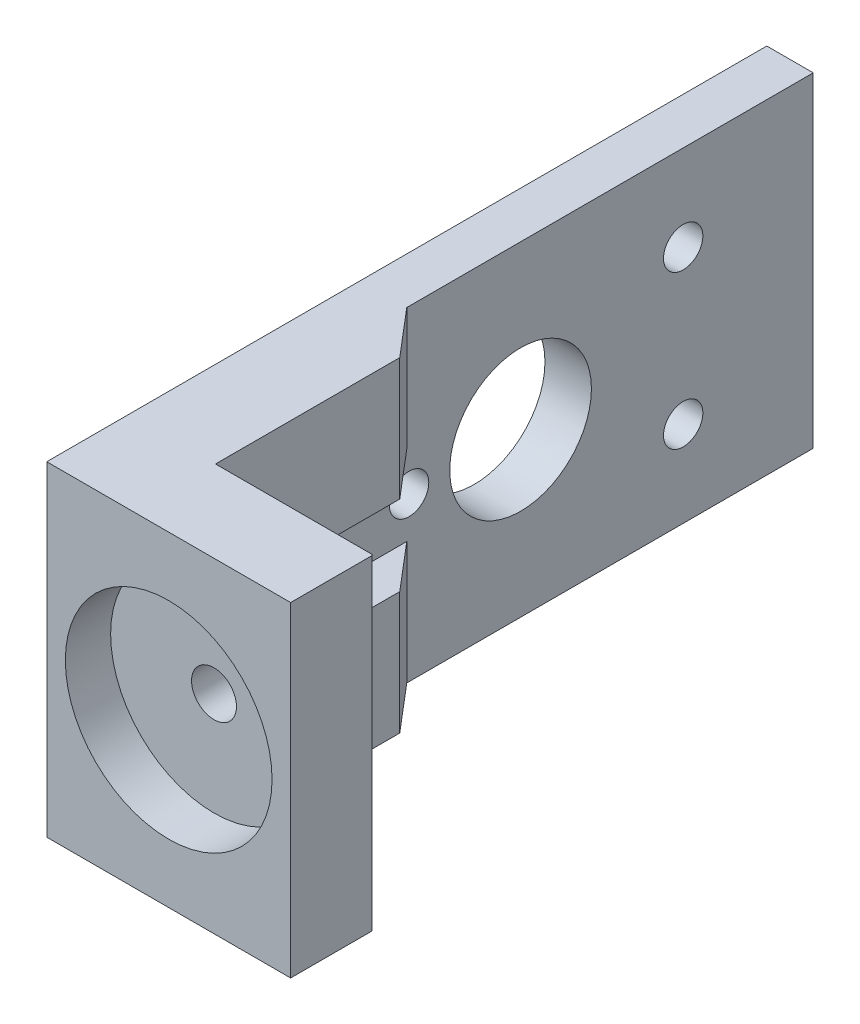
ISO-10303-21;
HEADER;
FILE_DESCRIPTION(('STEP AP214'),'2;1');
FILE_NAME('part.step','',(''),(''),'','','');
FILE_SCHEMA(('AUTOMOTIVE_DESIGN { 1 0 10303 214 1 1 1 1 }'));
ENDSEC;
DATA;
#1=APPLICATION_CONTEXT('core data for automotive mechanical design processes');
#2=APPLICATION_PROTOCOL_DEFINITION('international standard','automotive_design',2000,#1);
#3=PRODUCT_CONTEXT('',#1,'mechanical');
#4=PRODUCT('Part','Part','',(#3));
#5=PRODUCT_RELATED_PRODUCT_CATEGORY('part','',(#4));
#6=PRODUCT_DEFINITION_FORMATION('','',#4);
#7=PRODUCT_DEFINITION_CONTEXT('part definition',#1,'design');
#8=PRODUCT_DEFINITION('design','',#6,#7);
#9=PRODUCT_DEFINITION_SHAPE('','',#8);
#10=(LENGTH_UNIT() NAMED_UNIT(*) SI_UNIT(.MILLI.,.METRE.));
#11=(NAMED_UNIT(*) PLANE_ANGLE_UNIT() SI_UNIT($,.RADIAN.));
#12=(NAMED_UNIT(*) SI_UNIT($,.STERADIAN.) SOLID_ANGLE_UNIT());
#13=UNCERTAINTY_MEASURE_WITH_UNIT(LENGTH_MEASURE(1.E-05),#10,'distance_accuracy_value','');
#14=(GEOMETRIC_REPRESENTATION_CONTEXT(3) GLOBAL_UNCERTAINTY_ASSIGNED_CONTEXT((#13)) GLOBAL_UNIT_ASSIGNED_CONTEXT((#10,
#11,#12)) REPRESENTATION_CONTEXT('',''));
#15=CARTESIAN_POINT('',(0.,0.,0.));
#16=DIRECTION('',(0.,0.,1.));
#17=DIRECTION('',(1.,0.,0.));
#18=AXIS2_PLACEMENT_3D('',#15,#16,#17);
#19=CARTESIAN_POINT('',(5.08,22.1615,-34.29));
#20=DIRECTION('',(0.761939317759459,0.,-0.64764842009554));
#21=DIRECTION('',(-0.64764842009554,0.,-0.761939317759459));
#22=AXIS2_PLACEMENT_3D('',#19,#20,#21);
#23=PLANE('',#22);
#24=DIRECTION('',(0.,1.,0.));
#25=VECTOR('',#24,1.);
#26=CARTESIAN_POINT('',(9.44083677553739,22.1615,-29.1596037934854));
#27=LINE('',#26,#25);
#28=CARTESIAN_POINT('',(9.44083677553739,22.1615,-29.1596037934854));
#29=VERTEX_POINT('',#28);
#30=CARTESIAN_POINT('',(9.44083677553739,35.56,-29.1596037934854));
#31=VERTEX_POINT('',#30);
#32=EDGE_CURVE('E165',#29,#31,#27,.T.);
#33=ORIENTED_EDGE('',*,*,#32,.F.);
#34=DIRECTION('',(-0.64764842009554,0.,-0.76193931775946));
#35=VECTOR('',#34,1.);
#36=CARTESIAN_POINT('',(5.08,22.1615,-34.29));
#37=LINE('',#36,#35);
#38=CARTESIAN_POINT('',(5.08,22.1615,-34.29));
#39=VERTEX_POINT('',#38);
#40=EDGE_CURVE('E213',#29,#39,#37,.T.);
#41=ORIENTED_EDGE('',*,*,#40,.T.);
#42=DIRECTION('',(0.,1.,0.));
#43=VECTOR('',#42,1.);
#44=CARTESIAN_POINT('',(5.08,22.1615,-34.29));
#45=LINE('',#44,#43);
#46=CARTESIAN_POINT('',(5.08,35.56,-34.29));
#47=VERTEX_POINT('',#46);
#48=EDGE_CURVE('E219',#39,#47,#45,.T.);
#49=ORIENTED_EDGE('',*,*,#48,.T.);
#50=DIRECTION('',(-0.64764842009554,0.,-0.76193931775946));
#51=VECTOR('',#50,1.);
#52=CARTESIAN_POINT('',(5.08,35.56,-34.29));
#53=LINE('',#52,#51);
#54=EDGE_CURVE('E208',#31,#47,#53,.T.);
#55=ORIENTED_EDGE('',*,*,#54,.F.);
#56=EDGE_LOOP('',(#33,#41,#49,#55));
#57=FACE_BOUND('',#56,.T.);
#58=ADVANCED_FACE('F47',(#57),#23,.T.);
#59=CARTESIAN_POINT('',(5.08,13.3985,-34.29));
#60=DIRECTION('',(0.761939317759459,0.,-0.64764842009554));
#61=DIRECTION('',(-0.64764842009554,0.,-0.761939317759459));
#62=AXIS2_PLACEMENT_3D('',#59,#60,#61);
#63=PLANE('',#62);
#64=DIRECTION('',(0.,1.,0.));
#65=VECTOR('',#64,1.);
#66=CARTESIAN_POINT('',(9.44083677553739,13.3985,-29.1596037934854));
#67=LINE('',#66,#65);
#68=CARTESIAN_POINT('',(9.44083677553739,0.,-29.1596037934854));
#69=VERTEX_POINT('',#68);
#70=CARTESIAN_POINT('',(9.4408367755374,13.3985,-29.1596037934854));
#71=VERTEX_POINT('',#70);
#72=EDGE_CURVE('E182',#69,#71,#67,.T.);
#73=ORIENTED_EDGE('',*,*,#72,.F.);
#74=DIRECTION('',(0.64764842009554,0.,0.76193931775946));
#75=VECTOR('',#74,1.);
#76=CARTESIAN_POINT('',(5.08,0.,-34.29));
#77=LINE('',#76,#75);
#78=CARTESIAN_POINT('',(5.08,0.,-34.29));
#79=VERTEX_POINT('',#78);
#80=EDGE_CURVE('E202',#79,#69,#77,.T.);
#81=ORIENTED_EDGE('',*,*,#80,.F.);
#82=DIRECTION('',(0.,-1.,0.));
#83=VECTOR('',#82,1.);
#84=CARTESIAN_POINT('',(5.08,13.3985,-34.29));
#85=LINE('',#84,#83);
#86=CARTESIAN_POINT('',(5.08,13.3985,-34.29));
#87=VERTEX_POINT('',#86);
#88=EDGE_CURVE('E205',#87,#79,#85,.T.);
#89=ORIENTED_EDGE('',*,*,#88,.F.);
#90=DIRECTION('',(0.64764842009554,0.,0.76193931775946));
#91=VECTOR('',#90,1.);
#92=CARTESIAN_POINT('',(5.08,13.3985,-34.29));
#93=LINE('',#92,#91);
#94=EDGE_CURVE('E191',#87,#71,#93,.T.);
#95=ORIENTED_EDGE('',*,*,#94,.T.);
#96=EDGE_LOOP('',(#73,#81,#89,#95));
#97=FACE_BOUND('',#96,.T.);
#98=ADVANCED_FACE('F320',(#97),#63,.T.);
#99=CARTESIAN_POINT('',(0.,35.56,-8.89));
#100=DIRECTION('',(0.,0.,-1.));
#101=DIRECTION('',(-1.,0.,0.));
#102=AXIS2_PLACEMENT_3D('',#99,#100,#101);
#103=PLANE('',#102);
#104=CARTESIAN_POINT('',(13.335,17.78,-8.89));
#105=DIRECTION('',(0.,0.,-1.));
#106=DIRECTION('',(-1.,0.,0.));
#107=AXIS2_PLACEMENT_3D('',#104,#105,#106);
#108=CIRCLE('',#107,2.45745);
#109=CARTESIAN_POINT('',(10.87755,17.78,-8.89));
#110=VERTEX_POINT('',#109);
#111=EDGE_CURVE('E250',#110,#110,#108,.T.);
#112=ORIENTED_EDGE('',*,*,#111,.F.);
#113=EDGE_LOOP('',(#112));
#114=FACE_BOUND('',#113,.T.);
#115=DIRECTION('',(0.,-1.,0.));
#116=VECTOR('',#115,1.);
#117=CARTESIAN_POINT('',(26.67,35.56,-8.89));
#118=LINE('',#117,#116);
#119=CARTESIAN_POINT('',(26.67,22.1615,-8.89));
#120=VERTEX_POINT('',#119);
#121=CARTESIAN_POINT('',(26.67,13.3985,-8.89));
#122=VERTEX_POINT('',#121);
#123=EDGE_CURVE('E287',#120,#122,#118,.T.);
#124=ORIENTED_EDGE('',*,*,#123,.T.);
#125=DIRECTION('',(-1.,0.,0.));
#126=VECTOR('',#125,1.);
#127=CARTESIAN_POINT('',(26.67,13.3985,-8.89));
#128=LINE('',#127,#126);
#129=CARTESIAN_POINT('',(5.08,13.3985,-8.89));
#130=VERTEX_POINT('',#129);
#131=EDGE_CURVE('E194',#122,#130,#128,.T.);
#132=ORIENTED_EDGE('',*,*,#131,.T.);
#133=DIRECTION('',(0.,-1.,0.));
#134=VECTOR('',#133,1.);
#135=CARTESIAN_POINT('',(5.08,35.56,-8.89));
#136=LINE('',#135,#134);
#137=CARTESIAN_POINT('',(5.08,22.1615,-8.89));
#138=VERTEX_POINT('',#137);
#139=EDGE_CURVE('E273',#138,#130,#136,.T.);
#140=ORIENTED_EDGE('',*,*,#139,.F.);
#141=DIRECTION('',(1.,0.,0.));
#142=VECTOR('',#141,1.);
#143=CARTESIAN_POINT('',(26.67,22.1615,-8.89));
#144=LINE('',#143,#142);
#145=EDGE_CURVE('E211',#138,#120,#144,.T.);
#146=ORIENTED_EDGE('',*,*,#145,.T.);
#147=EDGE_LOOP('',(#124,#132,#140,#146));
#148=FACE_BOUND('',#147,.T.);
#149=ADVANCED_FACE('F330',(#114,#148),#103,.T.);
#150=CARTESIAN_POINT('',(5.08,35.56,0.));
#151=DIRECTION('',(1.,0.,0.));
#152=DIRECTION('',(0.,0.,-1.));
#153=AXIS2_PLACEMENT_3D('',#150,#151,#152);
#154=PLANE('',#153);
#155=ORIENTED_EDGE('',*,*,#88,.T.);
#156=DIRECTION('',(0.,0.,1.));
#157=VECTOR('',#156,1.);
#158=CARTESIAN_POINT('',(5.08,0.,0.));
#159=LINE('',#158,#157);
#160=CARTESIAN_POINT('',(5.08,0.,-78.74));
#161=VERTEX_POINT('',#160);
#162=EDGE_CURVE('E257',#161,#79,#159,.T.);
#163=ORIENTED_EDGE('',*,*,#162,.F.);
#164=DIRECTION('',(0.,-1.,0.));
#165=VECTOR('',#164,1.);
#166=CARTESIAN_POINT('',(5.08,35.56,-78.74));
#167=LINE('',#166,#165);
#168=CARTESIAN_POINT('',(5.08,35.56,-78.74));
#169=VERTEX_POINT('',#168);
#170=EDGE_CURVE('E299',#169,#161,#167,.T.);
#171=ORIENTED_EDGE('',*,*,#170,.F.);
#172=DIRECTION('',(0.,0.,1.));
#173=VECTOR('',#172,1.);
#174=CARTESIAN_POINT('',(5.08,35.56,0.));
#175=LINE('',#174,#173);
#176=EDGE_CURVE('E260',#169,#47,#175,.T.);
#177=ORIENTED_EDGE('',*,*,#176,.T.);
#178=ORIENTED_EDGE('',*,*,#48,.F.);
#179=DIRECTION('',(0.,0.,1.));
#180=VECTOR('',#179,1.);
#181=CARTESIAN_POINT('',(5.08,22.1615,-8.89));
#182=LINE('',#181,#180);
#183=EDGE_CURVE('E217',#39,#138,#182,.T.);
#184=ORIENTED_EDGE('',*,*,#183,.T.);
#185=ORIENTED_EDGE('',*,*,#139,.T.);
#186=DIRECTION('',(0.,0.,-1.));
#187=VECTOR('',#186,1.);
#188=CARTESIAN_POINT('',(5.08,13.3985,-8.89));
#189=LINE('',#188,#187);
#190=EDGE_CURVE('E198',#130,#87,#189,.T.);
#191=ORIENTED_EDGE('',*,*,#190,.T.);
#192=EDGE_LOOP('',(#155,#163,#171,#177,#178,#184,#185,#191));
#193=FACE_BOUND('',#192,.T.);
#194=CARTESIAN_POINT('',(5.08,26.162,-64.516));
#195=DIRECTION('',(1.,0.,0.));
#196=DIRECTION('',(0.,0.,-1.));
#197=AXIS2_PLACEMENT_3D('',#194,#195,#196);
#198=CIRCLE('',#197,2.15265);
#199=CARTESIAN_POINT('',(5.08,26.162,-66.66865));
#200=VERTEX_POINT('',#199);
#201=EDGE_CURVE('E223',#200,#200,#198,.T.);
#202=ORIENTED_EDGE('',*,*,#201,.F.);
#203=EDGE_LOOP('',(#202));
#204=FACE_BOUND('',#203,.T.);
#205=CARTESIAN_POINT('',(5.08,9.398,-64.516));
#206=DIRECTION('',(1.,0.,0.));
#207=DIRECTION('',(0.,0.,-1.));
#208=AXIS2_PLACEMENT_3D('',#205,#206,#207);
#209=CIRCLE('',#208,2.15265);
#210=CARTESIAN_POINT('',(5.08,9.398,-66.66865));
#211=VERTEX_POINT('',#210);
#212=EDGE_CURVE('E229',#211,#211,#209,.T.);
#213=ORIENTED_EDGE('',*,*,#212,.F.);
#214=EDGE_LOOP('',(#213));
#215=FACE_BOUND('',#214,.T.);
#216=CARTESIAN_POINT('',(5.08,17.78,-34.544));
#217=DIRECTION('',(1.,0.,0.));
#218=DIRECTION('',(0.,0.,-1.));
#219=AXIS2_PLACEMENT_3D('',#216,#217,#218);
#220=CIRCLE('',#219,2.15265);
#221=CARTESIAN_POINT('',(5.08,17.78,-36.69665));
#222=VERTEX_POINT('',#221);
#223=EDGE_CURVE('E235',#222,#222,#220,.T.);
#224=ORIENTED_EDGE('',*,*,#223,.F.);
#225=EDGE_LOOP('',(#224));
#226=FACE_BOUND('',#225,.T.);
#227=CARTESIAN_POINT('',(5.08,17.78,-46.736));
#228=DIRECTION('',(1.,0.,0.));
#229=DIRECTION('',(0.,0.,-1.));
#230=AXIS2_PLACEMENT_3D('',#227,#228,#229);
#231=CIRCLE('',#230,7.747);
#232=CARTESIAN_POINT('',(5.08,17.78,-54.483));
#233=VERTEX_POINT('',#232);
#234=EDGE_CURVE('E241',#233,#233,#231,.T.);
#235=ORIENTED_EDGE('',*,*,#234,.F.);
#236=EDGE_LOOP('',(#235));
#237=FACE_BOUND('',#236,.T.);
#238=ADVANCED_FACE('F49',(#193,#204,#215,#226,#237),#154,.T.);
#239=CARTESIAN_POINT('',(0.,35.56,-78.74));
#240=DIRECTION('',(0.,0.,-1.));
#241=DIRECTION('',(-1.,0.,0.));
#242=AXIS2_PLACEMENT_3D('',#239,#240,#241);
#243=PLANE('',#242);
#244=DIRECTION('',(1.,0.,0.));
#245=VECTOR('',#244,1.);
#246=CARTESIAN_POINT('',(0.,0.,-78.74));
#247=LINE('',#246,#245);
#248=CARTESIAN_POINT('',(0.,0.,-78.74));
#249=VERTEX_POINT('',#248);
#250=EDGE_CURVE('E276',#249,#161,#247,.T.);
#251=ORIENTED_EDGE('',*,*,#250,.F.);
#252=DIRECTION('',(0.,-1.,0.));
#253=VECTOR('',#252,1.);
#254=CARTESIAN_POINT('',(0.,35.56,-78.74));
#255=LINE('',#254,#253);
#256=CARTESIAN_POINT('',(0.,35.56,-78.74));
#257=VERTEX_POINT('',#256);
#258=EDGE_CURVE('E297',#257,#249,#255,.T.);
#259=ORIENTED_EDGE('',*,*,#258,.F.);
#260=DIRECTION('',(1.,0.,0.));
#261=VECTOR('',#260,1.);
#262=CARTESIAN_POINT('',(0.,35.56,-78.74));
#263=LINE('',#262,#261);
#264=EDGE_CURVE('E263',#257,#169,#263,.T.);
#265=ORIENTED_EDGE('',*,*,#264,.T.);
#266=ORIENTED_EDGE('',*,*,#170,.T.);
#267=EDGE_LOOP('',(#251,#259,#265,#266));
#268=FACE_BOUND('',#267,.T.);
#269=ADVANCED_FACE('F366',(#268),#243,.T.);
#270=CARTESIAN_POINT('',(0.,35.56,0.));
#271=DIRECTION('',(1.,0.,0.));
#272=DIRECTION('',(0.,0.,-1.));
#273=AXIS2_PLACEMENT_3D('',#270,#271,#272);
#274=PLANE('',#273);
#275=CARTESIAN_POINT('',(0.,26.162,-64.516));
#276=DIRECTION('',(1.,0.,0.));
#277=DIRECTION('',(0.,0.,-1.));
#278=AXIS2_PLACEMENT_3D('',#275,#276,#277);
#279=CIRCLE('',#278,2.15265);
#280=CARTESIAN_POINT('',(0.,26.162,-66.66865));
#281=VERTEX_POINT('',#280);
#282=EDGE_CURVE('E226',#281,#281,#279,.T.);
#283=ORIENTED_EDGE('',*,*,#282,.T.);
#284=EDGE_LOOP('',(#283));
#285=FACE_BOUND('',#284,.T.);
#286=CARTESIAN_POINT('',(0.,9.398,-64.516));
#287=DIRECTION('',(1.,0.,0.));
#288=DIRECTION('',(0.,0.,-1.));
#289=AXIS2_PLACEMENT_3D('',#286,#287,#288);
#290=CIRCLE('',#289,2.15265);
#291=CARTESIAN_POINT('',(0.,9.398,-66.66865));
#292=VERTEX_POINT('',#291);
#293=EDGE_CURVE('E232',#292,#292,#290,.T.);
#294=ORIENTED_EDGE('',*,*,#293,.T.);
#295=EDGE_LOOP('',(#294));
#296=FACE_BOUND('',#295,.T.);
#297=CARTESIAN_POINT('',(0.,17.78,-34.544));
#298=DIRECTION('',(1.,0.,0.));
#299=DIRECTION('',(0.,0.,-1.));
#300=AXIS2_PLACEMENT_3D('',#297,#298,#299);
#301=CIRCLE('',#300,2.15265);
#302=CARTESIAN_POINT('',(0.,17.78,-36.69665));
#303=VERTEX_POINT('',#302);
#304=EDGE_CURVE('E238',#303,#303,#301,.T.);
#305=ORIENTED_EDGE('',*,*,#304,.T.);
#306=EDGE_LOOP('',(#305));
#307=FACE_BOUND('',#306,.T.);
#308=CARTESIAN_POINT('',(0.,17.78,-46.736));
#309=DIRECTION('',(1.,0.,0.));
#310=DIRECTION('',(0.,0.,-1.));
#311=AXIS2_PLACEMENT_3D('',#308,#309,#310);
#312=CIRCLE('',#311,7.747);
#313=CARTESIAN_POINT('',(0.,17.78,-54.483));
#314=VERTEX_POINT('',#313);
#315=EDGE_CURVE('E244',#314,#314,#312,.F.);
#316=ORIENTED_EDGE('',*,*,#315,.F.);
#317=EDGE_LOOP('',(#316));
#318=FACE_BOUND('',#317,.T.);
#319=DIRECTION('',(0.,0.,1.));
#320=VECTOR('',#319,1.);
#321=CARTESIAN_POINT('',(0.,0.,0.));
#322=LINE('',#321,#320);
#323=CARTESIAN_POINT('',(0.,0.,0.));
#324=VERTEX_POINT('',#323);
#325=EDGE_CURVE('E279',#249,#324,#322,.T.);
#326=ORIENTED_EDGE('',*,*,#325,.T.);
#327=DIRECTION('',(0.,-1.,0.));
#328=VECTOR('',#327,1.);
#329=CARTESIAN_POINT('',(0.,35.56,0.));
#330=LINE('',#329,#328);
#331=CARTESIAN_POINT('',(0.,35.56,0.));
#332=VERTEX_POINT('',#331);
#333=EDGE_CURVE('E294',#332,#324,#330,.T.);
#334=ORIENTED_EDGE('',*,*,#333,.F.);
#335=DIRECTION('',(0.,0.,1.));
#336=VECTOR('',#335,1.);
#337=CARTESIAN_POINT('',(0.,35.56,0.));
#338=LINE('',#337,#336);
#339=EDGE_CURVE('E267',#257,#332,#338,.T.);
#340=ORIENTED_EDGE('',*,*,#339,.F.);
#341=ORIENTED_EDGE('',*,*,#258,.T.);
#342=EDGE_LOOP('',(#326,#334,#340,#341));
#343=FACE_BOUND('',#342,.T.);
#344=ADVANCED_FACE('F370',(#285,#296,#307,#318,#343),#274,.F.);
#345=CARTESIAN_POINT('',(0.,35.56,0.));
#346=DIRECTION('',(0.,0.,-1.));
#347=DIRECTION('',(-1.,0.,0.));
#348=AXIS2_PLACEMENT_3D('',#345,#346,#347);
#349=PLANE('',#348);
#350=CARTESIAN_POINT('',(13.335,17.78,0.));
#351=DIRECTION('',(0.,0.,1.));
#352=DIRECTION('',(1.,0.,0.));
#353=AXIS2_PLACEMENT_3D('',#350,#351,#352);
#354=CIRCLE('',#353,11.303);
#355=CARTESIAN_POINT('',(24.638,17.78,0.));
#356=VERTEX_POINT('',#355);
#357=EDGE_CURVE('E253',#356,#356,#354,.T.);
#358=ORIENTED_EDGE('',*,*,#357,.F.);
#359=EDGE_LOOP('',(#358));
#360=FACE_BOUND('',#359,.T.);
#361=DIRECTION('',(1.,0.,0.));
#362=VECTOR('',#361,1.);
#363=CARTESIAN_POINT('',(0.,0.,0.));
#364=LINE('',#363,#362);
#365=CARTESIAN_POINT('',(26.67,0.,0.));
#366=VERTEX_POINT('',#365);
#367=EDGE_CURVE('E281',#324,#366,#364,.T.);
#368=ORIENTED_EDGE('',*,*,#367,.T.);
#369=DIRECTION('',(0.,-1.,0.));
#370=VECTOR('',#369,1.);
#371=CARTESIAN_POINT('',(26.67,35.56,0.));
#372=LINE('',#371,#370);
#373=CARTESIAN_POINT('',(26.67,35.56,0.));
#374=VERTEX_POINT('',#373);
#375=EDGE_CURVE('E291',#374,#366,#372,.T.);
#376=ORIENTED_EDGE('',*,*,#375,.F.);
#377=DIRECTION('',(1.,0.,0.));
#378=VECTOR('',#377,1.);
#379=CARTESIAN_POINT('',(0.,35.56,0.));
#380=LINE('',#379,#378);
#381=EDGE_CURVE('E269',#332,#374,#380,.T.);
#382=ORIENTED_EDGE('',*,*,#381,.F.);
#383=ORIENTED_EDGE('',*,*,#333,.T.);
#384=EDGE_LOOP('',(#368,#376,#382,#383));
#385=FACE_BOUND('',#384,.T.);
#386=ADVANCED_FACE('F374',(#360,#385),#349,.F.);
#387=CARTESIAN_POINT('',(26.67,35.56,0.));
#388=DIRECTION('',(-1.,0.,0.));
#389=DIRECTION('',(0.,0.,1.));
#390=AXIS2_PLACEMENT_3D('',#387,#388,#389);
#391=PLANE('',#390);
#392=DIRECTION('',(0.,0.,-1.));
#393=VECTOR('',#392,1.);
#394=CARTESIAN_POINT('',(26.67,0.,0.));
#395=LINE('',#394,#393);
#396=CARTESIAN_POINT('',(26.67,0.,-8.89));
#397=VERTEX_POINT('',#396);
#398=EDGE_CURVE('E264',#366,#397,#395,.T.);
#399=ORIENTED_EDGE('',*,*,#398,.T.);
#400=DIRECTION('',(0.,-1.,0.));
#401=VECTOR('',#400,1.);
#402=CARTESIAN_POINT('',(26.67,13.3985,-8.89));
#403=LINE('',#402,#401);
#404=EDGE_CURVE('E201',#122,#397,#403,.T.);
#405=ORIENTED_EDGE('',*,*,#404,.F.);
#406=ORIENTED_EDGE('',*,*,#123,.F.);
#407=CARTESIAN_POINT('',(26.67,35.56,-8.89));
#408=VERTEX_POINT('',#407);
#409=EDGE_CURVE('E288',#408,#120,#118,.T.);
#410=ORIENTED_EDGE('',*,*,#409,.F.);
#411=DIRECTION('',(0.,0.,-1.));
#412=VECTOR('',#411,1.);
#413=CARTESIAN_POINT('',(26.67,35.56,0.));
#414=LINE('',#413,#412);
#415=EDGE_CURVE('E271',#374,#408,#414,.T.);
#416=ORIENTED_EDGE('',*,*,#415,.F.);
#417=ORIENTED_EDGE('',*,*,#375,.T.);
#418=EDGE_LOOP('',(#399,#405,#406,#410,#416,#417));
#419=FACE_BOUND('',#418,.T.);
#420=ADVANCED_FACE('F341',(#419),#391,.F.);
#421=CARTESIAN_POINT('',(0.,35.56,0.));
#422=DIRECTION('',(0.,1.,0.));
#423=DIRECTION('',(0.,0.,1.));
#424=AXIS2_PLACEMENT_3D('',#421,#422,#423);
#425=PLANE('',#424);
#426=DIRECTION('',(0.,0.,1.));
#427=VECTOR('',#426,1.);
#428=CARTESIAN_POINT('',(9.44083677553739,35.56,-39.6984234044729));
#429=LINE('',#428,#427);
#430=CARTESIAN_POINT('',(9.4408367755374,35.56,-9.01429390087601));
#431=VERTEX_POINT('',#430);
#432=EDGE_CURVE('E162',#31,#431,#429,.T.);
#433=ORIENTED_EDGE('',*,*,#432,.F.);
#434=ORIENTED_EDGE('',*,*,#54,.T.);
#435=ORIENTED_EDGE('',*,*,#176,.F.);
#436=ORIENTED_EDGE('',*,*,#264,.F.);
#437=ORIENTED_EDGE('',*,*,#339,.T.);
#438=ORIENTED_EDGE('',*,*,#381,.T.);
#439=ORIENTED_EDGE('',*,*,#415,.T.);
#440=CARTESIAN_POINT('',(26.5643501842554,35.56,-9.01429390087602));
#441=VERTEX_POINT('',#440);
#442=EDGE_CURVE('E172',#408,#441,#53,.T.);
#443=ORIENTED_EDGE('',*,*,#442,.T.);
#444=DIRECTION('',(1.,0.,0.));
#445=VECTOR('',#444,1.);
#446=CARTESIAN_POINT('',(9.4408367755374,35.56,-9.01429390087601));
#447=LINE('',#446,#445);
#448=EDGE_CURVE('E156',#431,#441,#447,.T.);
#449=ORIENTED_EDGE('',*,*,#448,.F.);
#450=EDGE_LOOP('',(#433,#434,#435,#436,#437,#438,#439,#443,#449));
#451=FACE_BOUND('',#450,.T.);
#452=ADVANCED_FACE('F170',(#451),#425,.T.);
#453=CARTESIAN_POINT('',(0.,0.,0.));
#454=DIRECTION('',(0.,1.,0.));
#455=DIRECTION('',(0.,0.,1.));
#456=AXIS2_PLACEMENT_3D('',#453,#454,#455);
#457=PLANE('',#456);
#458=ORIENTED_EDGE('',*,*,#80,.T.);
#459=DIRECTION('',(0.,0.,1.));
#460=VECTOR('',#459,1.);
#461=CARTESIAN_POINT('',(9.4408367755374,0.,0.));
#462=LINE('',#461,#460);
#463=CARTESIAN_POINT('',(9.4408367755374,0.,-9.01429390087601));
#464=VERTEX_POINT('',#463);
#465=EDGE_CURVE('E184',#69,#464,#462,.T.);
#466=ORIENTED_EDGE('',*,*,#465,.T.);
#467=DIRECTION('',(1.,0.,0.));
#468=VECTOR('',#467,1.);
#469=CARTESIAN_POINT('',(0.,0.,-9.01429390087601));
#470=LINE('',#469,#468);
#471=CARTESIAN_POINT('',(26.5643501842554,0.,-9.01429390087601));
#472=VERTEX_POINT('',#471);
#473=EDGE_CURVE('E177',#464,#472,#470,.T.);
#474=ORIENTED_EDGE('',*,*,#473,.T.);
#475=EDGE_CURVE('E190',#472,#397,#77,.T.);
#476=ORIENTED_EDGE('',*,*,#475,.T.);
#477=ORIENTED_EDGE('',*,*,#398,.F.);
#478=ORIENTED_EDGE('',*,*,#367,.F.);
#479=ORIENTED_EDGE('',*,*,#325,.F.);
#480=ORIENTED_EDGE('',*,*,#250,.T.);
#481=ORIENTED_EDGE('',*,*,#162,.T.);
#482=EDGE_LOOP('',(#458,#466,#474,#476,#477,#478,#479,#480,#481));
#483=FACE_BOUND('',#482,.T.);
#484=ADVANCED_FACE('F314',(#483),#457,.F.);
#485=CARTESIAN_POINT('',(13.335,17.78,-4.953));
#486=DIRECTION('',(0.,0.,1.));
#487=DIRECTION('',(1.,0.,0.));
#488=AXIS2_PLACEMENT_3D('',#485,#486,#487);
#489=CYLINDRICAL_SURFACE('',#488,11.303);
#490=CARTESIAN_POINT('',(13.335,17.78,-4.953));
#491=DIRECTION('',(0.,0.,1.));
#492=DIRECTION('',(1.,0.,0.));
#493=AXIS2_PLACEMENT_3D('',#490,#491,#492);
#494=CIRCLE('',#493,11.303);
#495=CARTESIAN_POINT('',(24.638,17.78,-4.953));
#496=VERTEX_POINT('',#495);
#497=EDGE_CURVE('E254',#496,#496,#494,.T.);
#498=ORIENTED_EDGE('',*,*,#497,.F.);
#499=EDGE_LOOP('',(#498));
#500=FACE_BOUND('',#499,.T.);
#501=ORIENTED_EDGE('',*,*,#357,.T.);
#502=EDGE_LOOP('',(#501));
#503=FACE_BOUND('',#502,.T.);
#504=ADVANCED_FACE('F400',(#500,#503),#489,.F.);
#505=CARTESIAN_POINT('',(13.335,17.78,-4.953));
#506=DIRECTION('',(0.,0.,1.));
#507=DIRECTION('',(1.,0.,0.));
#508=AXIS2_PLACEMENT_3D('',#505,#506,#507);
#509=PLANE('',#508);
#510=CARTESIAN_POINT('',(13.335,17.78,-4.953));
#511=DIRECTION('',(0.,0.,1.));
#512=DIRECTION('',(1.,0.,0.));
#513=AXIS2_PLACEMENT_3D('',#510,#511,#512);
#514=CIRCLE('',#513,2.45745);
#515=CARTESIAN_POINT('',(15.79245,17.78,-4.953));
#516=VERTEX_POINT('',#515);
#517=EDGE_CURVE('E247',#516,#516,#514,.T.);
#518=ORIENTED_EDGE('',*,*,#517,.F.);
#519=EDGE_LOOP('',(#518));
#520=FACE_BOUND('',#519,.T.);
#521=ORIENTED_EDGE('',*,*,#497,.T.);
#522=EDGE_LOOP('',(#521));
#523=FACE_BOUND('',#522,.T.);
#524=ADVANCED_FACE('F404',(#520,#523),#509,.T.);
#525=CARTESIAN_POINT('',(13.335,17.78,-4.953));
#526=DIRECTION('',(0.,0.,1.));
#527=DIRECTION('',(1.,0.,0.));
#528=AXIS2_PLACEMENT_3D('',#525,#526,#527);
#529=CYLINDRICAL_SURFACE('',#528,2.45745);
#530=ORIENTED_EDGE('',*,*,#517,.T.);
#531=EDGE_LOOP('',(#530));
#532=FACE_BOUND('',#531,.T.);
#533=ORIENTED_EDGE('',*,*,#111,.T.);
#534=EDGE_LOOP('',(#533));
#535=FACE_BOUND('',#534,.T.);
#536=ADVANCED_FACE('F408',(#532,#535),#529,.F.);
#537=CARTESIAN_POINT('',(-0.00100000000000967,17.78,-46.736));
#538=DIRECTION('',(1.,0.,0.));
#539=DIRECTION('',(0.,0.,-1.));
#540=AXIS2_PLACEMENT_3D('',#537,#538,#539);
#541=CYLINDRICAL_SURFACE('',#540,7.747);
#542=ORIENTED_EDGE('',*,*,#234,.T.);
#543=EDGE_LOOP('',(#542));
#544=FACE_BOUND('',#543,.T.);
#545=ORIENTED_EDGE('',*,*,#315,.T.);
#546=EDGE_LOOP('',(#545));
#547=FACE_BOUND('',#546,.T.);
#548=ADVANCED_FACE('F412',(#544,#547),#541,.F.);
#549=CARTESIAN_POINT('',(5.08,17.78,-34.544));
#550=DIRECTION('',(1.,0.,0.));
#551=DIRECTION('',(0.,0.,-1.));
#552=AXIS2_PLACEMENT_3D('',#549,#550,#551);
#553=CYLINDRICAL_SURFACE('',#552,2.15265);
#554=ORIENTED_EDGE('',*,*,#304,.F.);
#555=EDGE_LOOP('',(#554));
#556=FACE_BOUND('',#555,.T.);
#557=ORIENTED_EDGE('',*,*,#223,.T.);
#558=EDGE_LOOP('',(#557));
#559=FACE_BOUND('',#558,.T.);
#560=ADVANCED_FACE('F416',(#556,#559),#553,.F.);
#561=CARTESIAN_POINT('',(5.08,9.398,-64.516));
#562=DIRECTION('',(1.,0.,0.));
#563=DIRECTION('',(0.,0.,-1.));
#564=AXIS2_PLACEMENT_3D('',#561,#562,#563);
#565=CYLINDRICAL_SURFACE('',#564,2.15265);
#566=ORIENTED_EDGE('',*,*,#293,.F.);
#567=EDGE_LOOP('',(#566));
#568=FACE_BOUND('',#567,.T.);
#569=ORIENTED_EDGE('',*,*,#212,.T.);
#570=EDGE_LOOP('',(#569));
#571=FACE_BOUND('',#570,.T.);
#572=ADVANCED_FACE('F354',(#568,#571),#565,.F.);
#573=CARTESIAN_POINT('',(5.08,26.162,-64.516));
#574=DIRECTION('',(1.,0.,0.));
#575=DIRECTION('',(0.,0.,-1.));
#576=AXIS2_PLACEMENT_3D('',#573,#574,#575);
#577=CYLINDRICAL_SURFACE('',#576,2.15265);
#578=ORIENTED_EDGE('',*,*,#282,.F.);
#579=EDGE_LOOP('',(#578));
#580=FACE_BOUND('',#579,.T.);
#581=ORIENTED_EDGE('',*,*,#201,.T.);
#582=EDGE_LOOP('',(#581));
#583=FACE_BOUND('',#582,.T.);
#584=ADVANCED_FACE('F346',(#580,#583),#577,.F.);
#585=DIRECTION('',(0.,-1.,0.));
#586=VECTOR('',#585,1.);
#587=CARTESIAN_POINT('',(26.5643501842554,22.1615,-9.01429390087601));
#588=LINE('',#587,#586);
#589=CARTESIAN_POINT('',(26.5643501842554,22.1615,-9.01429390087601));
#590=VERTEX_POINT('',#589);
#591=EDGE_CURVE('E62',#441,#590,#588,.T.);
#592=ORIENTED_EDGE('',*,*,#591,.F.);
#593=ORIENTED_EDGE('',*,*,#442,.F.);
#594=ORIENTED_EDGE('',*,*,#409,.T.);
#595=EDGE_CURVE('E214',#120,#590,#37,.T.);
#596=ORIENTED_EDGE('',*,*,#595,.T.);
#597=EDGE_LOOP('',(#592,#593,#594,#596));
#598=FACE_BOUND('',#597,.T.);
#599=ADVANCED_FACE('F344',(#598),#23,.T.);
#600=CARTESIAN_POINT('',(0.,22.1615,0.));
#601=DIRECTION('',(0.,-1.,0.));
#602=DIRECTION('',(0.,0.,-1.));
#603=AXIS2_PLACEMENT_3D('',#600,#601,#602);
#604=PLANE('',#603);
#605=DIRECTION('',(0.,0.,-1.));
#606=VECTOR('',#605,1.);
#607=CARTESIAN_POINT('',(9.4408367755374,22.1615,0.));
#608=LINE('',#607,#606);
#609=CARTESIAN_POINT('',(9.4408367755374,22.1615,-9.01429390087601));
#610=VERTEX_POINT('',#609);
#611=EDGE_CURVE('E187',#610,#29,#608,.T.);
#612=ORIENTED_EDGE('',*,*,#611,.F.);
#613=DIRECTION('',(-1.,0.,0.));
#614=VECTOR('',#613,1.);
#615=CARTESIAN_POINT('',(0.,22.1615,-9.01429390087601));
#616=LINE('',#615,#614);
#617=EDGE_CURVE('E157',#590,#610,#616,.T.);
#618=ORIENTED_EDGE('',*,*,#617,.F.);
#619=ORIENTED_EDGE('',*,*,#595,.F.);
#620=ORIENTED_EDGE('',*,*,#145,.F.);
#621=ORIENTED_EDGE('',*,*,#183,.F.);
#622=ORIENTED_EDGE('',*,*,#40,.F.);
#623=EDGE_LOOP('',(#612,#618,#619,#620,#621,#622));
#624=FACE_BOUND('',#623,.T.);
#625=ADVANCED_FACE('F337',(#624),#604,.T.);
#626=DIRECTION('',(0.,-1.,0.));
#627=VECTOR('',#626,1.);
#628=CARTESIAN_POINT('',(26.5643501842554,13.3985,-9.01429390087601));
#629=LINE('',#628,#627);
#630=CARTESIAN_POINT('',(26.5643501842554,13.3985,-9.01429390087601));
#631=VERTEX_POINT('',#630);
#632=EDGE_CURVE('E175',#631,#472,#629,.T.);
#633=ORIENTED_EDGE('',*,*,#632,.F.);
#634=EDGE_CURVE('E195',#631,#122,#93,.T.);
#635=ORIENTED_EDGE('',*,*,#634,.T.);
#636=ORIENTED_EDGE('',*,*,#404,.T.);
#637=ORIENTED_EDGE('',*,*,#475,.F.);
#638=EDGE_LOOP('',(#633,#635,#636,#637));
#639=FACE_BOUND('',#638,.T.);
#640=ADVANCED_FACE('F310',(#639),#63,.T.);
#641=CARTESIAN_POINT('',(0.,13.3985,0.));
#642=DIRECTION('',(0.,-1.,0.));
#643=DIRECTION('',(0.,0.,-1.));
#644=AXIS2_PLACEMENT_3D('',#641,#642,#643);
#645=PLANE('',#644);
#646=DIRECTION('',(-1.,0.,0.));
#647=VECTOR('',#646,1.);
#648=CARTESIAN_POINT('',(0.,13.3985,-9.01429390087601));
#649=LINE('',#648,#647);
#650=CARTESIAN_POINT('',(9.4408367755374,13.3985,-9.01429390087601));
#651=VERTEX_POINT('',#650);
#652=EDGE_CURVE('E55',#631,#651,#649,.T.);
#653=ORIENTED_EDGE('',*,*,#652,.T.);
#654=DIRECTION('',(0.,0.,-1.));
#655=VECTOR('',#654,1.);
#656=CARTESIAN_POINT('',(9.4408367755374,13.3985,0.));
#657=LINE('',#656,#655);
#658=EDGE_CURVE('E11',#651,#71,#657,.T.);
#659=ORIENTED_EDGE('',*,*,#658,.T.);
#660=ORIENTED_EDGE('',*,*,#94,.F.);
#661=ORIENTED_EDGE('',*,*,#190,.F.);
#662=ORIENTED_EDGE('',*,*,#131,.F.);
#663=ORIENTED_EDGE('',*,*,#634,.F.);
#664=EDGE_LOOP('',(#653,#659,#660,#661,#662,#663));
#665=FACE_BOUND('',#664,.T.);
#666=ADVANCED_FACE('F303',(#665),#645,.F.);
#667=CARTESIAN_POINT('',(9.4408367755374,-86.36,-9.01429390087601));
#668=DIRECTION('',(0.,0.,1.));
#669=DIRECTION('',(1.,0.,0.));
#670=AXIS2_PLACEMENT_3D('',#667,#668,#669);
#671=PLANE('',#670);
#672=DIRECTION('',(0.,1.,0.));
#673=VECTOR('',#672,1.);
#674=CARTESIAN_POINT('',(9.4408367755374,-86.36,-9.01429390087601));
#675=LINE('',#674,#673);
#676=EDGE_CURVE('E70',#464,#651,#675,.T.);
#677=ORIENTED_EDGE('',*,*,#676,.T.);
#678=ORIENTED_EDGE('',*,*,#652,.F.);
#679=ORIENTED_EDGE('',*,*,#632,.T.);
#680=ORIENTED_EDGE('',*,*,#473,.F.);
#681=EDGE_LOOP('',(#677,#678,#679,#680));
#682=FACE_BOUND('',#681,.T.);
#683=ADVANCED_FACE('F307',(#682),#671,.F.);
#684=CARTESIAN_POINT('',(9.44083677553739,-86.36,-39.6984234044729));
#685=DIRECTION('',(-1.,0.,0.));
#686=DIRECTION('',(0.,0.,1.));
#687=AXIS2_PLACEMENT_3D('',#684,#685,#686);
#688=PLANE('',#687);
#689=ORIENTED_EDGE('',*,*,#72,.T.);
#690=ORIENTED_EDGE('',*,*,#658,.F.);
#691=ORIENTED_EDGE('',*,*,#676,.F.);
#692=ORIENTED_EDGE('',*,*,#465,.F.);
#693=EDGE_LOOP('',(#689,#690,#691,#692));
#694=FACE_BOUND('',#693,.T.);
#695=ADVANCED_FACE('F317',(#694),#688,.F.);
#696=ORIENTED_EDGE('',*,*,#32,.T.);
#697=ORIENTED_EDGE('',*,*,#432,.T.);
#698=EDGE_CURVE('E152',#610,#431,#675,.T.);
#699=ORIENTED_EDGE('',*,*,#698,.F.);
#700=ORIENTED_EDGE('',*,*,#611,.T.);
#701=EDGE_LOOP('',(#696,#697,#699,#700));
#702=FACE_BOUND('',#701,.T.);
#703=ADVANCED_FACE('F163',(#702),#688,.F.);
#704=ORIENTED_EDGE('',*,*,#591,.T.);
#705=ORIENTED_EDGE('',*,*,#617,.T.);
#706=ORIENTED_EDGE('',*,*,#698,.T.);
#707=ORIENTED_EDGE('',*,*,#448,.T.);
#708=EDGE_LOOP('',(#704,#705,#706,#707));
#709=FACE_BOUND('',#708,.T.);
#710=ADVANCED_FACE('F154',(#709),#671,.F.);
#711=CLOSED_SHELL('',(#58,#98,#149,#238,#269,#344,#386,#420,#452,#484,#504,#524,#536,#548,#560,
#572,#584,#599,#625,#640,#666,#683,#695,#703,#710));
#712=MANIFOLD_SOLID_BREP('B2',#711);
#713=ADVANCED_BREP_SHAPE_REPRESENTATION('',(#18,#712),#14);
#714=SHAPE_DEFINITION_REPRESENTATION(#9,#713);
ENDSEC;
END-ISO-10303-21;
